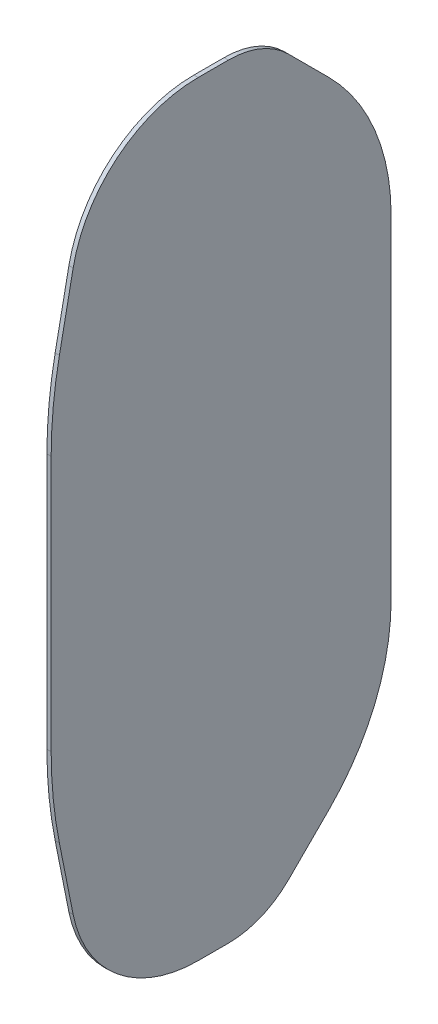
ISO-10303-21;
HEADER;
FILE_DESCRIPTION(('STEP AP214'),'2;1');
FILE_NAME('part.step','',(''),(''),'','','');
FILE_SCHEMA(('AUTOMOTIVE_DESIGN { 1 0 10303 214 1 1 1 1 }'));
ENDSEC;
DATA;
#1=APPLICATION_CONTEXT('core data for automotive mechanical design processes');
#2=APPLICATION_PROTOCOL_DEFINITION('international standard','automotive_design',2000,#1);
#3=PRODUCT_CONTEXT('',#1,'mechanical');
#4=PRODUCT('Part','Part','',(#3));
#5=PRODUCT_RELATED_PRODUCT_CATEGORY('part','',(#4));
#6=PRODUCT_DEFINITION_FORMATION('','',#4);
#7=PRODUCT_DEFINITION_CONTEXT('part definition',#1,'design');
#8=PRODUCT_DEFINITION('design','',#6,#7);
#9=PRODUCT_DEFINITION_SHAPE('','',#8);
#10=(LENGTH_UNIT() NAMED_UNIT(*) SI_UNIT(.MILLI.,.METRE.));
#11=(NAMED_UNIT(*) PLANE_ANGLE_UNIT() SI_UNIT($,.RADIAN.));
#12=(NAMED_UNIT(*) SI_UNIT($,.STERADIAN.) SOLID_ANGLE_UNIT());
#13=UNCERTAINTY_MEASURE_WITH_UNIT(LENGTH_MEASURE(1.E-05),#10,'distance_accuracy_value','');
#14=(GEOMETRIC_REPRESENTATION_CONTEXT(3) GLOBAL_UNCERTAINTY_ASSIGNED_CONTEXT((#13)) GLOBAL_UNIT_ASSIGNED_CONTEXT((#10,
#11,#12)) REPRESENTATION_CONTEXT('',''));
#15=CARTESIAN_POINT('',(0.,0.,0.));
#16=DIRECTION('',(0.,0.,1.));
#17=DIRECTION('',(1.,0.,0.));
#18=AXIS2_PLACEMENT_3D('',#15,#16,#17);
#19=CARTESIAN_POINT('',(1.,90.,30.));
#20=DIRECTION('',(0.,-0.196116135138184,-0.98058067569092));
#21=DIRECTION('',(0.,0.98058067569092,-0.196116135138184));
#22=AXIS2_PLACEMENT_3D('',#19,#20,#21);
#23=PLANE('',#22);
#24=DIRECTION('',(0.,-0.98058067569092,0.196116135138184));
#25=VECTOR('',#24,1.);
#26=CARTESIAN_POINT('',(1.,90.,30.));
#27=LINE('',#26,#25);
#28=CARTESIAN_POINT('',(1.,65.8834840541455,34.8233031891709));
#29=VERTEX_POINT('',#28);
#30=CARTESIAN_POINT('',(1.,49.7096621545399,38.058067569092));
#31=VERTEX_POINT('',#30);
#32=EDGE_CURVE('E202',#29,#31,#27,.T.);
#33=ORIENTED_EDGE('',*,*,#32,.F.);
#34=DIRECTION('',(-1.,0.,0.));
#35=VECTOR('',#34,1.);
#36=CARTESIAN_POINT('',(1.,65.8834840541455,34.8233031891709));
#37=LINE('',#36,#35);
#38=CARTESIAN_POINT('',(0.,65.8834840541455,34.8233031891709));
#39=VERTEX_POINT('',#38);
#40=EDGE_CURVE('E214',#29,#39,#37,.T.);
#41=ORIENTED_EDGE('',*,*,#40,.T.);
#42=DIRECTION('',(0.,-0.98058067569092,0.196116135138184));
#43=VECTOR('',#42,1.);
#44=CARTESIAN_POINT('',(0.,90.,30.));
#45=LINE('',#44,#43);
#46=CARTESIAN_POINT('',(0.,49.7096621545399,38.058067569092));
#47=VERTEX_POINT('',#46);
#48=EDGE_CURVE('E182',#39,#47,#45,.T.);
#49=ORIENTED_EDGE('',*,*,#48,.T.);
#50=DIRECTION('',(-1.,0.,0.));
#51=VECTOR('',#50,1.);
#52=CARTESIAN_POINT('',(1.,49.7096621545399,38.058067569092));
#53=LINE('',#52,#51);
#54=EDGE_CURVE('E161',#47,#31,#53,.F.);
#55=ORIENTED_EDGE('',*,*,#54,.T.);
#56=EDGE_LOOP('',(#33,#41,#49,#55));
#57=FACE_BOUND('',#56,.T.);
#58=ADVANCED_FACE('F41',(#57),#23,.F.);
#59=CARTESIAN_POINT('',(1.,-40.,40.));
#60=DIRECTION('',(0.,0.,-1.));
#61=DIRECTION('',(0.,1.,0.));
#62=AXIS2_PLACEMENT_3D('',#59,#60,#61);
#63=PLANE('',#62);
#64=DIRECTION('',(0.,-1.,0.));
#65=VECTOR('',#64,1.);
#66=CARTESIAN_POINT('',(1.,-40.,40.));
#67=LINE('',#66,#65);
#68=CARTESIAN_POINT('',(1.,30.0980486407215,40.));
#69=VERTEX_POINT('',#68);
#70=CARTESIAN_POINT('',(1.,-30.0980486407215,40.));
#71=VERTEX_POINT('',#70);
#72=EDGE_CURVE('E176',#69,#71,#67,.T.);
#73=ORIENTED_EDGE('',*,*,#72,.F.);
#74=DIRECTION('',(-1.,0.,0.));
#75=VECTOR('',#74,1.);
#76=CARTESIAN_POINT('',(1.,30.0980486407215,40.));
#77=LINE('',#76,#75);
#78=CARTESIAN_POINT('',(0.,30.0980486407215,40.));
#79=VERTEX_POINT('',#78);
#80=EDGE_CURVE('E163',#69,#79,#77,.T.);
#81=ORIENTED_EDGE('',*,*,#80,.T.);
#82=DIRECTION('',(0.,-1.,0.));
#83=VECTOR('',#82,1.);
#84=CARTESIAN_POINT('',(0.,-40.,40.));
#85=LINE('',#84,#83);
#86=CARTESIAN_POINT('',(0.,-30.0980486407215,40.));
#87=VERTEX_POINT('',#86);
#88=EDGE_CURVE('E173',#79,#87,#85,.T.);
#89=ORIENTED_EDGE('',*,*,#88,.T.);
#90=DIRECTION('',(-1.,0.,0.));
#91=VECTOR('',#90,1.);
#92=CARTESIAN_POINT('',(1.,-30.0980486407215,40.));
#93=LINE('',#92,#91);
#94=EDGE_CURVE('E180',#87,#71,#93,.F.);
#95=ORIENTED_EDGE('',*,*,#94,.T.);
#96=EDGE_LOOP('',(#73,#81,#89,#95));
#97=FACE_BOUND('',#96,.T.);
#98=ADVANCED_FACE('F175',(#97),#63,.F.);
#99=CARTESIAN_POINT('',(1.,-90.,30.));
#100=DIRECTION('',(0.,0.196116135138184,-0.98058067569092));
#101=DIRECTION('',(0.,0.98058067569092,0.196116135138184));
#102=AXIS2_PLACEMENT_3D('',#99,#100,#101);
#103=PLANE('',#102);
#104=DIRECTION('',(0.,-0.98058067569092,-0.196116135138184));
#105=VECTOR('',#104,1.);
#106=CARTESIAN_POINT('',(0.,-90.,30.));
#107=LINE('',#106,#105);
#108=CARTESIAN_POINT('',(0.,-49.7096621545399,38.058067569092));
#109=VERTEX_POINT('',#108);
#110=CARTESIAN_POINT('',(0.,-65.8834840541455,34.8233031891709));
#111=VERTEX_POINT('',#110);
#112=EDGE_CURVE('E185',#109,#111,#107,.T.);
#113=ORIENTED_EDGE('',*,*,#112,.T.);
#114=DIRECTION('',(-1.,0.,0.));
#115=VECTOR('',#114,1.);
#116=CARTESIAN_POINT('',(1.,-65.8834840541455,34.8233031891709));
#117=LINE('',#116,#115);
#118=CARTESIAN_POINT('',(1.,-65.8834840541455,34.8233031891709));
#119=VERTEX_POINT('',#118);
#120=EDGE_CURVE('E233',#111,#119,#117,.F.);
#121=ORIENTED_EDGE('',*,*,#120,.T.);
#122=DIRECTION('',(0.,-0.98058067569092,-0.196116135138184));
#123=VECTOR('',#122,1.);
#124=CARTESIAN_POINT('',(1.,-90.,30.));
#125=LINE('',#124,#123);
#126=CARTESIAN_POINT('',(1.,-49.7096621545399,38.058067569092));
#127=VERTEX_POINT('',#126);
#128=EDGE_CURVE('E308',#127,#119,#125,.T.);
#129=ORIENTED_EDGE('',*,*,#128,.F.);
#130=DIRECTION('',(-1.,0.,0.));
#131=VECTOR('',#130,1.);
#132=CARTESIAN_POINT('',(1.,-49.7096621545399,38.058067569092));
#133=LINE('',#132,#131);
#134=EDGE_CURVE('E208',#127,#109,#133,.T.);
#135=ORIENTED_EDGE('',*,*,#134,.T.);
#136=EDGE_LOOP('',(#113,#121,#129,#135));
#137=FACE_BOUND('',#136,.T.);
#138=ADVANCED_FACE('F302',(#137),#103,.F.);
#139=CARTESIAN_POINT('',(1.,-90.,-10.));
#140=DIRECTION('',(0.,1.,0.));
#141=DIRECTION('',(0.,0.,1.));
#142=AXIS2_PLACEMENT_3D('',#139,#140,#141);
#143=PLANE('',#142);
#144=DIRECTION('',(0.,0.,-1.));
#145=VECTOR('',#144,1.);
#146=CARTESIAN_POINT('',(0.,-90.,-10.));
#147=LINE('',#146,#145);
#148=CARTESIAN_POINT('',(0.,-90.,5.40588291844339));
#149=VERTEX_POINT('',#148);
#150=CARTESIAN_POINT('',(0.,-90.,-1.71572875253807));
#151=VERTEX_POINT('',#150);
#152=EDGE_CURVE('E187',#149,#151,#147,.T.);
#153=ORIENTED_EDGE('',*,*,#152,.T.);
#154=DIRECTION('',(-1.,0.,0.));
#155=VECTOR('',#154,1.);
#156=CARTESIAN_POINT('',(1.,-90.,-1.71572875253807));
#157=LINE('',#156,#155);
#158=CARTESIAN_POINT('',(1.,-90.,-1.71572875253807));
#159=VERTEX_POINT('',#158);
#160=EDGE_CURVE('E241',#151,#159,#157,.F.);
#161=ORIENTED_EDGE('',*,*,#160,.T.);
#162=DIRECTION('',(0.,0.,-1.));
#163=VECTOR('',#162,1.);
#164=CARTESIAN_POINT('',(1.,-90.,0.));
#165=LINE('',#164,#163);
#166=CARTESIAN_POINT('',(1.,-90.,5.40588291844339));
#167=VERTEX_POINT('',#166);
#168=EDGE_CURVE('E296',#167,#159,#165,.T.);
#169=ORIENTED_EDGE('',*,*,#168,.F.);
#170=DIRECTION('',(-1.,0.,0.));
#171=VECTOR('',#170,1.);
#172=CARTESIAN_POINT('',(1.,-90.,5.40588291844339));
#173=LINE('',#172,#171);
#174=EDGE_CURVE('E226',#167,#149,#173,.T.);
#175=ORIENTED_EDGE('',*,*,#174,.T.);
#176=EDGE_LOOP('',(#153,#161,#169,#175));
#177=FACE_BOUND('',#176,.T.);
#178=ADVANCED_FACE('F295',(#177),#143,.F.);
#179=CARTESIAN_POINT('',(1.,-90.,-10.));
#180=DIRECTION('',(0.,0.707106781186548,0.707106781186547));
#181=DIRECTION('',(0.,-0.707106781186547,0.707106781186548));
#182=AXIS2_PLACEMENT_3D('',#179,#180,#181);
#183=PLANE('',#182);
#184=DIRECTION('',(0.,0.707106781186547,-0.707106781186548));
#185=VECTOR('',#184,1.);
#186=CARTESIAN_POINT('',(0.,-90.,-10.));
#187=LINE('',#186,#185);
#188=CARTESIAN_POINT('',(0.,-84.1421356237309,-15.8578643762691));
#189=VERTEX_POINT('',#188);
#190=CARTESIAN_POINT('',(0.,-74.6446609406726,-25.3553390593274));
#191=VERTEX_POINT('',#190);
#192=EDGE_CURVE('E194',#189,#191,#187,.T.);
#193=ORIENTED_EDGE('',*,*,#192,.T.);
#194=DIRECTION('',(-1.,0.,0.));
#195=VECTOR('',#194,1.);
#196=CARTESIAN_POINT('',(1.,-74.6446609406726,-25.3553390593274));
#197=LINE('',#196,#195);
#198=CARTESIAN_POINT('',(1.,-74.6446609406726,-25.3553390593274));
#199=VERTEX_POINT('',#198);
#200=EDGE_CURVE('E11',#191,#199,#197,.F.);
#201=ORIENTED_EDGE('',*,*,#200,.T.);
#202=DIRECTION('',(0.,0.707106781186547,-0.707106781186548));
#203=VECTOR('',#202,1.);
#204=CARTESIAN_POINT('',(1.,-90.,-10.));
#205=LINE('',#204,#203);
#206=CARTESIAN_POINT('',(1.,-84.1421356237309,-15.8578643762691));
#207=VERTEX_POINT('',#206);
#208=EDGE_CURVE('E290',#207,#199,#205,.T.);
#209=ORIENTED_EDGE('',*,*,#208,.F.);
#210=DIRECTION('',(-1.,0.,0.));
#211=VECTOR('',#210,1.);
#212=CARTESIAN_POINT('',(1.,-84.1421356237309,-15.8578643762691));
#213=LINE('',#212,#211);
#214=EDGE_CURVE('E231',#207,#189,#213,.T.);
#215=ORIENTED_EDGE('',*,*,#214,.T.);
#216=EDGE_LOOP('',(#193,#201,#209,#215));
#217=FACE_BOUND('',#216,.T.);
#218=ADVANCED_FACE('F282',(#217),#183,.F.);
#219=CARTESIAN_POINT('',(1.,-60.,-40.));
#220=DIRECTION('',(0.,0.,1.));
#221=DIRECTION('',(0.,-1.,0.));
#222=AXIS2_PLACEMENT_3D('',#219,#220,#221);
#223=PLANE('',#222);
#224=DIRECTION('',(0.,1.,0.));
#225=VECTOR('',#224,1.);
#226=CARTESIAN_POINT('',(0.,-60.,-40.));
#227=LINE('',#226,#225);
#228=CARTESIAN_POINT('',(0.,-39.2893218813453,-40.));
#229=VERTEX_POINT('',#228);
#230=CARTESIAN_POINT('',(0.,39.2893218813453,-40.));
#231=VERTEX_POINT('',#230);
#232=EDGE_CURVE('E193',#229,#231,#227,.T.);
#233=ORIENTED_EDGE('',*,*,#232,.T.);
#234=DIRECTION('',(-1.,0.,0.));
#235=VECTOR('',#234,1.);
#236=CARTESIAN_POINT('',(1.,39.2893218813453,-40.));
#237=LINE('',#236,#235);
#238=CARTESIAN_POINT('',(1.,39.2893218813453,-40.));
#239=VERTEX_POINT('',#238);
#240=EDGE_CURVE('E65',#231,#239,#237,.F.);
#241=ORIENTED_EDGE('',*,*,#240,.T.);
#242=DIRECTION('',(0.,1.,0.));
#243=VECTOR('',#242,1.);
#244=CARTESIAN_POINT('',(1.,-60.,-40.));
#245=LINE('',#244,#243);
#246=CARTESIAN_POINT('',(1.,-39.2893218813453,-40.));
#247=VERTEX_POINT('',#246);
#248=EDGE_CURVE('E268',#247,#239,#245,.T.);
#249=ORIENTED_EDGE('',*,*,#248,.F.);
#250=DIRECTION('',(-1.,0.,0.));
#251=VECTOR('',#250,1.);
#252=CARTESIAN_POINT('',(1.,-39.2893218813453,-40.));
#253=LINE('',#252,#251);
#254=EDGE_CURVE('E258',#247,#229,#253,.T.);
#255=ORIENTED_EDGE('',*,*,#254,.T.);
#256=EDGE_LOOP('',(#233,#241,#249,#255));
#257=FACE_BOUND('',#256,.T.);
#258=ADVANCED_FACE('F278',(#257),#223,.F.);
#259=CARTESIAN_POINT('',(1.,90.,-10.));
#260=DIRECTION('',(0.,-0.707106781186548,0.707106781186547));
#261=DIRECTION('',(0.,-0.707106781186547,-0.707106781186548));
#262=AXIS2_PLACEMENT_3D('',#259,#260,#261);
#263=PLANE('',#262);
#264=DIRECTION('',(0.,0.707106781186547,0.707106781186548));
#265=VECTOR('',#264,1.);
#266=CARTESIAN_POINT('',(1.,90.,-10.));
#267=LINE('',#266,#265);
#268=CARTESIAN_POINT('',(1.,74.6446609406726,-25.3553390593274));
#269=VERTEX_POINT('',#268);
#270=CARTESIAN_POINT('',(1.,84.1421356237309,-15.8578643762691));
#271=VERTEX_POINT('',#270);
#272=EDGE_CURVE('E266',#269,#271,#267,.T.);
#273=ORIENTED_EDGE('',*,*,#272,.F.);
#274=DIRECTION('',(-1.,0.,0.));
#275=VECTOR('',#274,1.);
#276=CARTESIAN_POINT('',(1.,74.6446609406726,-25.3553390593274));
#277=LINE('',#276,#275);
#278=CARTESIAN_POINT('',(0.,74.6446609406726,-25.3553390593274));
#279=VERTEX_POINT('',#278);
#280=EDGE_CURVE('E254',#269,#279,#277,.T.);
#281=ORIENTED_EDGE('',*,*,#280,.T.);
#282=DIRECTION('',(0.,0.707106781186547,0.707106781186548));
#283=VECTOR('',#282,1.);
#284=CARTESIAN_POINT('',(0.,90.,-10.));
#285=LINE('',#284,#283);
#286=CARTESIAN_POINT('',(0.,84.1421356237309,-15.8578643762691));
#287=VERTEX_POINT('',#286);
#288=EDGE_CURVE('E200',#279,#287,#285,.T.);
#289=ORIENTED_EDGE('',*,*,#288,.T.);
#290=DIRECTION('',(-1.,0.,0.));
#291=VECTOR('',#290,1.);
#292=CARTESIAN_POINT('',(1.,84.1421356237309,-15.8578643762691));
#293=LINE('',#292,#291);
#294=EDGE_CURVE('E249',#287,#271,#293,.F.);
#295=ORIENTED_EDGE('',*,*,#294,.T.);
#296=EDGE_LOOP('',(#273,#281,#289,#295));
#297=FACE_BOUND('',#296,.T.);
#298=ADVANCED_FACE('F274',(#297),#263,.F.);
#299=CARTESIAN_POINT('',(1.,90.,0.));
#300=DIRECTION('',(0.,-1.,0.));
#301=DIRECTION('',(0.,0.,-1.));
#302=AXIS2_PLACEMENT_3D('',#299,#300,#301);
#303=PLANE('',#302);
#304=DIRECTION('',(0.,0.,1.));
#305=VECTOR('',#304,1.);
#306=CARTESIAN_POINT('',(1.,90.,-10.));
#307=LINE('',#306,#305);
#308=CARTESIAN_POINT('',(1.,90.,-1.71572875253815));
#309=VERTEX_POINT('',#308);
#310=CARTESIAN_POINT('',(1.,90.,5.40588291844328));
#311=VERTEX_POINT('',#310);
#312=EDGE_CURVE('E205',#309,#311,#307,.T.);
#313=ORIENTED_EDGE('',*,*,#312,.F.);
#314=DIRECTION('',(-1.,0.,0.));
#315=VECTOR('',#314,1.);
#316=CARTESIAN_POINT('',(1.,90.,-1.71572875253815));
#317=LINE('',#316,#315);
#318=CARTESIAN_POINT('',(0.,90.,-1.71572875253815));
#319=VERTEX_POINT('',#318);
#320=EDGE_CURVE('E250',#309,#319,#317,.T.);
#321=ORIENTED_EDGE('',*,*,#320,.T.);
#322=DIRECTION('',(0.,0.,1.));
#323=VECTOR('',#322,1.);
#324=CARTESIAN_POINT('',(0.,90.,0.));
#325=LINE('',#324,#323);
#326=CARTESIAN_POINT('',(0.,90.,5.40588291844327));
#327=VERTEX_POINT('',#326);
#328=EDGE_CURVE('E199',#319,#327,#325,.T.);
#329=ORIENTED_EDGE('',*,*,#328,.T.);
#330=DIRECTION('',(-1.,0.,0.));
#331=VECTOR('',#330,1.);
#332=CARTESIAN_POINT('',(1.,90.,5.40588291844327));
#333=LINE('',#332,#331);
#334=EDGE_CURVE('E222',#327,#311,#333,.F.);
#335=ORIENTED_EDGE('',*,*,#334,.T.);
#336=EDGE_LOOP('',(#313,#321,#329,#335));
#337=FACE_BOUND('',#336,.T.);
#338=ADVANCED_FACE('F321',(#337),#303,.F.);
#339=CARTESIAN_POINT('',(1.,0.,0.));
#340=DIRECTION('',(-1.,0.,0.));
#341=DIRECTION('',(0.,0.,1.));
#342=AXIS2_PLACEMENT_3D('',#339,#340,#341);
#343=PLANE('',#342);
#344=ORIENTED_EDGE('',*,*,#248,.T.);
#345=CARTESIAN_POINT('',(1.,39.2893218813453,9.99999999999998));
#346=DIRECTION('',(-1.,0.,0.));
#347=DIRECTION('',(0.,0.,1.));
#348=AXIS2_PLACEMENT_3D('',#345,#346,#347);
#349=CIRCLE('',#348,50.);
#350=EDGE_CURVE('E47',#239,#269,#349,.F.);
#351=ORIENTED_EDGE('',*,*,#350,.T.);
#352=ORIENTED_EDGE('',*,*,#272,.T.);
#353=CARTESIAN_POINT('',(1.,70.,-1.71572875253813));
#354=DIRECTION('',(-1.,0.,0.));
#355=DIRECTION('',(0.,0.,1.));
#356=AXIS2_PLACEMENT_3D('',#353,#354,#355);
#357=CIRCLE('',#356,20.);
#358=EDGE_CURVE('E243',#271,#309,#357,.F.);
#359=ORIENTED_EDGE('',*,*,#358,.T.);
#360=ORIENTED_EDGE('',*,*,#312,.T.);
#361=CARTESIAN_POINT('',(1.,60.,5.4058829184433));
#362=DIRECTION('',(-1.,0.,0.));
#363=DIRECTION('',(0.,0.,1.));
#364=AXIS2_PLACEMENT_3D('',#361,#362,#363);
#365=CIRCLE('',#364,30.);
#366=EDGE_CURVE('E228',#311,#29,#365,.F.);
#367=ORIENTED_EDGE('',*,*,#366,.T.);
#368=ORIENTED_EDGE('',*,*,#32,.T.);
#369=CARTESIAN_POINT('',(1.,30.0980486407215,-60.));
#370=DIRECTION('',(-1.,0.,0.));
#371=DIRECTION('',(0.,0.,1.));
#372=AXIS2_PLACEMENT_3D('',#369,#370,#371);
#373=CIRCLE('',#372,100.);
#374=EDGE_CURVE('E206',#31,#69,#373,.F.);
#375=ORIENTED_EDGE('',*,*,#374,.T.);
#376=ORIENTED_EDGE('',*,*,#72,.T.);
#377=CARTESIAN_POINT('',(1.,-30.0980486407215,-60.));
#378=DIRECTION('',(-1.,0.,0.));
#379=DIRECTION('',(0.,0.,1.));
#380=AXIS2_PLACEMENT_3D('',#377,#378,#379);
#381=CIRCLE('',#380,100.);
#382=EDGE_CURVE('E207',#71,#127,#381,.F.);
#383=ORIENTED_EDGE('',*,*,#382,.T.);
#384=ORIENTED_EDGE('',*,*,#128,.T.);
#385=CARTESIAN_POINT('',(1.,-60.,5.4058829184433));
#386=DIRECTION('',(-1.,0.,0.));
#387=DIRECTION('',(0.,0.,1.));
#388=AXIS2_PLACEMENT_3D('',#385,#386,#387);
#389=CIRCLE('',#388,30.);
#390=EDGE_CURVE('E221',#119,#167,#389,.F.);
#391=ORIENTED_EDGE('',*,*,#390,.T.);
#392=ORIENTED_EDGE('',*,*,#168,.T.);
#393=CARTESIAN_POINT('',(1.,-70.,-1.71572875253812));
#394=DIRECTION('',(-1.,0.,0.));
#395=DIRECTION('',(0.,0.,1.));
#396=AXIS2_PLACEMENT_3D('',#393,#394,#395);
#397=CIRCLE('',#396,20.);
#398=EDGE_CURVE('E244',#159,#207,#397,.F.);
#399=ORIENTED_EDGE('',*,*,#398,.T.);
#400=ORIENTED_EDGE('',*,*,#208,.T.);
#401=CARTESIAN_POINT('',(1.,-39.2893218813453,9.99999999999999));
#402=DIRECTION('',(-1.,0.,0.));
#403=DIRECTION('',(0.,0.,1.));
#404=AXIS2_PLACEMENT_3D('',#401,#402,#403);
#405=CIRCLE('',#404,50.);
#406=EDGE_CURVE('E264',#199,#247,#405,.F.);
#407=ORIENTED_EDGE('',*,*,#406,.T.);
#408=EDGE_LOOP('',(#344,#351,#352,#359,#360,#367,#368,#375,#376,#383,#384,#391,#392,#399,#400,#407));
#409=FACE_BOUND('',#408,.T.);
#410=ADVANCED_FACE('F269',(#409),#343,.F.);
#411=CARTESIAN_POINT('',(0.,0.,0.));
#412=DIRECTION('',(-1.,0.,0.));
#413=DIRECTION('',(0.,0.,1.));
#414=AXIS2_PLACEMENT_3D('',#411,#412,#413);
#415=PLANE('',#414);
#416=ORIENTED_EDGE('',*,*,#288,.F.);
#417=CARTESIAN_POINT('',(0.,39.2893218813453,9.99999999999998));
#418=DIRECTION('',(-1.,0.,0.));
#419=DIRECTION('',(0.,0.,1.));
#420=AXIS2_PLACEMENT_3D('',#417,#418,#419);
#421=CIRCLE('',#420,50.);
#422=EDGE_CURVE('E259',#279,#231,#421,.T.);
#423=ORIENTED_EDGE('',*,*,#422,.T.);
#424=ORIENTED_EDGE('',*,*,#232,.F.);
#425=CARTESIAN_POINT('',(0.,-39.2893218813453,9.99999999999999));
#426=DIRECTION('',(-1.,0.,0.));
#427=DIRECTION('',(0.,0.,1.));
#428=AXIS2_PLACEMENT_3D('',#425,#426,#427);
#429=CIRCLE('',#428,50.);
#430=EDGE_CURVE('E257',#229,#191,#429,.T.);
#431=ORIENTED_EDGE('',*,*,#430,.T.);
#432=ORIENTED_EDGE('',*,*,#192,.F.);
#433=CARTESIAN_POINT('',(0.,-70.,-1.71572875253812));
#434=DIRECTION('',(-1.,0.,0.));
#435=DIRECTION('',(0.,0.,1.));
#436=AXIS2_PLACEMENT_3D('',#433,#434,#435);
#437=CIRCLE('',#436,20.);
#438=EDGE_CURVE('E237',#189,#151,#437,.T.);
#439=ORIENTED_EDGE('',*,*,#438,.T.);
#440=ORIENTED_EDGE('',*,*,#152,.F.);
#441=CARTESIAN_POINT('',(0.,-60.,5.4058829184433));
#442=DIRECTION('',(-1.,0.,0.));
#443=DIRECTION('',(0.,0.,1.));
#444=AXIS2_PLACEMENT_3D('',#441,#442,#443);
#445=CIRCLE('',#444,30.);
#446=EDGE_CURVE('E218',#149,#111,#445,.T.);
#447=ORIENTED_EDGE('',*,*,#446,.T.);
#448=ORIENTED_EDGE('',*,*,#112,.F.);
#449=CARTESIAN_POINT('',(0.,-30.0980486407215,-60.));
#450=DIRECTION('',(-1.,0.,0.));
#451=DIRECTION('',(0.,0.,1.));
#452=AXIS2_PLACEMENT_3D('',#449,#450,#451);
#453=CIRCLE('',#452,100.);
#454=EDGE_CURVE('E170',#109,#87,#453,.T.);
#455=ORIENTED_EDGE('',*,*,#454,.T.);
#456=ORIENTED_EDGE('',*,*,#88,.F.);
#457=CARTESIAN_POINT('',(0.,30.0980486407215,-60.));
#458=DIRECTION('',(-1.,0.,0.));
#459=DIRECTION('',(0.,0.,1.));
#460=AXIS2_PLACEMENT_3D('',#457,#458,#459);
#461=CIRCLE('',#460,100.);
#462=EDGE_CURVE('E160',#79,#47,#461,.T.);
#463=ORIENTED_EDGE('',*,*,#462,.T.);
#464=ORIENTED_EDGE('',*,*,#48,.F.);
#465=CARTESIAN_POINT('',(0.,60.,5.4058829184433));
#466=DIRECTION('',(-1.,0.,0.));
#467=DIRECTION('',(0.,0.,1.));
#468=AXIS2_PLACEMENT_3D('',#465,#466,#467);
#469=CIRCLE('',#468,30.);
#470=EDGE_CURVE('E216',#39,#327,#469,.T.);
#471=ORIENTED_EDGE('',*,*,#470,.T.);
#472=ORIENTED_EDGE('',*,*,#328,.F.);
#473=CARTESIAN_POINT('',(0.,70.,-1.71572875253813));
#474=DIRECTION('',(-1.,0.,0.));
#475=DIRECTION('',(0.,0.,1.));
#476=AXIS2_PLACEMENT_3D('',#473,#474,#475);
#477=CIRCLE('',#476,20.);
#478=EDGE_CURVE('E236',#319,#287,#477,.T.);
#479=ORIENTED_EDGE('',*,*,#478,.T.);
#480=EDGE_LOOP('',(#416,#423,#424,#431,#432,#439,#440,#447,#448,#455,#456,#463,#464,#471,#472,#479));
#481=FACE_BOUND('',#480,.T.);
#482=ADVANCED_FACE('F179',(#481),#415,.T.);
#483=CARTESIAN_POINT('',(1.,30.0980486407215,-60.));
#484=DIRECTION('',(-1.,0.,0.));
#485=DIRECTION('',(0.,0.,1.));
#486=AXIS2_PLACEMENT_3D('',#483,#484,#485);
#487=CYLINDRICAL_SURFACE('',#486,100.);
#488=ORIENTED_EDGE('',*,*,#374,.F.);
#489=ORIENTED_EDGE('',*,*,#54,.F.);
#490=ORIENTED_EDGE('',*,*,#462,.F.);
#491=ORIENTED_EDGE('',*,*,#80,.F.);
#492=EDGE_LOOP('',(#488,#489,#490,#491));
#493=FACE_BOUND('',#492,.T.);
#494=ADVANCED_FACE('F158',(#493),#487,.T.);
#495=CARTESIAN_POINT('',(1.,-30.0980486407215,-60.));
#496=DIRECTION('',(-1.,0.,0.));
#497=DIRECTION('',(0.,0.,1.));
#498=AXIS2_PLACEMENT_3D('',#495,#496,#497);
#499=CYLINDRICAL_SURFACE('',#498,100.);
#500=ORIENTED_EDGE('',*,*,#382,.F.);
#501=ORIENTED_EDGE('',*,*,#94,.F.);
#502=ORIENTED_EDGE('',*,*,#454,.F.);
#503=ORIENTED_EDGE('',*,*,#134,.F.);
#504=EDGE_LOOP('',(#500,#501,#502,#503));
#505=FACE_BOUND('',#504,.T.);
#506=ADVANCED_FACE('F311',(#505),#499,.T.);
#507=CARTESIAN_POINT('',(1.,60.,5.4058829184433));
#508=DIRECTION('',(-1.,0.,0.));
#509=DIRECTION('',(0.,0.,1.));
#510=AXIS2_PLACEMENT_3D('',#507,#508,#509);
#511=CYLINDRICAL_SURFACE('',#510,30.);
#512=ORIENTED_EDGE('',*,*,#366,.F.);
#513=ORIENTED_EDGE('',*,*,#334,.F.);
#514=ORIENTED_EDGE('',*,*,#470,.F.);
#515=ORIENTED_EDGE('',*,*,#40,.F.);
#516=EDGE_LOOP('',(#512,#513,#514,#515));
#517=FACE_BOUND('',#516,.T.);
#518=ADVANCED_FACE('F326',(#517),#511,.T.);
#519=CARTESIAN_POINT('',(1.,-60.,5.4058829184433));
#520=DIRECTION('',(-1.,0.,0.));
#521=DIRECTION('',(0.,0.,1.));
#522=AXIS2_PLACEMENT_3D('',#519,#520,#521);
#523=CYLINDRICAL_SURFACE('',#522,30.);
#524=ORIENTED_EDGE('',*,*,#390,.F.);
#525=ORIENTED_EDGE('',*,*,#120,.F.);
#526=ORIENTED_EDGE('',*,*,#446,.F.);
#527=ORIENTED_EDGE('',*,*,#174,.F.);
#528=EDGE_LOOP('',(#524,#525,#526,#527));
#529=FACE_BOUND('',#528,.T.);
#530=ADVANCED_FACE('F301',(#529),#523,.T.);
#531=CARTESIAN_POINT('',(1.,-70.,-1.71572875253812));
#532=DIRECTION('',(-1.,0.,0.));
#533=DIRECTION('',(0.,0.,1.));
#534=AXIS2_PLACEMENT_3D('',#531,#532,#533);
#535=CYLINDRICAL_SURFACE('',#534,20.);
#536=ORIENTED_EDGE('',*,*,#398,.F.);
#537=ORIENTED_EDGE('',*,*,#160,.F.);
#538=ORIENTED_EDGE('',*,*,#438,.F.);
#539=ORIENTED_EDGE('',*,*,#214,.F.);
#540=EDGE_LOOP('',(#536,#537,#538,#539));
#541=FACE_BOUND('',#540,.T.);
#542=ADVANCED_FACE('F288',(#541),#535,.T.);
#543=CARTESIAN_POINT('',(1.,70.,-1.71572875253813));
#544=DIRECTION('',(-1.,0.,0.));
#545=DIRECTION('',(0.,0.,1.));
#546=AXIS2_PLACEMENT_3D('',#543,#544,#545);
#547=CYLINDRICAL_SURFACE('',#546,20.);
#548=ORIENTED_EDGE('',*,*,#358,.F.);
#549=ORIENTED_EDGE('',*,*,#294,.F.);
#550=ORIENTED_EDGE('',*,*,#478,.F.);
#551=ORIENTED_EDGE('',*,*,#320,.F.);
#552=EDGE_LOOP('',(#548,#549,#550,#551));
#553=FACE_BOUND('',#552,.T.);
#554=ADVANCED_FACE('F332',(#553),#547,.T.);
#555=CARTESIAN_POINT('',(1.,39.2893218813453,9.99999999999998));
#556=DIRECTION('',(-1.,0.,0.));
#557=DIRECTION('',(0.,0.,1.));
#558=AXIS2_PLACEMENT_3D('',#555,#556,#557);
#559=CYLINDRICAL_SURFACE('',#558,50.);
#560=ORIENTED_EDGE('',*,*,#350,.F.);
#561=ORIENTED_EDGE('',*,*,#240,.F.);
#562=ORIENTED_EDGE('',*,*,#422,.F.);
#563=ORIENTED_EDGE('',*,*,#280,.F.);
#564=EDGE_LOOP('',(#560,#561,#562,#563));
#565=FACE_BOUND('',#564,.T.);
#566=ADVANCED_FACE('F279',(#565),#559,.T.);
#567=CARTESIAN_POINT('',(1.,-39.2893218813453,9.99999999999999));
#568=DIRECTION('',(-1.,0.,0.));
#569=DIRECTION('',(0.,0.,1.));
#570=AXIS2_PLACEMENT_3D('',#567,#568,#569);
#571=CYLINDRICAL_SURFACE('',#570,50.);
#572=ORIENTED_EDGE('',*,*,#406,.F.);
#573=ORIENTED_EDGE('',*,*,#200,.F.);
#574=ORIENTED_EDGE('',*,*,#430,.F.);
#575=ORIENTED_EDGE('',*,*,#254,.F.);
#576=EDGE_LOOP('',(#572,#573,#574,#575));
#577=FACE_BOUND('',#576,.T.);
#578=ADVANCED_FACE('F43',(#577),#571,.T.);
#579=CLOSED_SHELL('',(#58,#98,#138,#178,#218,#258,#298,#338,#410,#482,#494,#506,#518,#530,#542,
#554,#566,#578));
#580=MANIFOLD_SOLID_BREP('B2',#579);
#581=ADVANCED_BREP_SHAPE_REPRESENTATION('',(#18,#580),#14);
#582=SHAPE_DEFINITION_REPRESENTATION(#9,#581);
ENDSEC;
END-ISO-10303-21;
